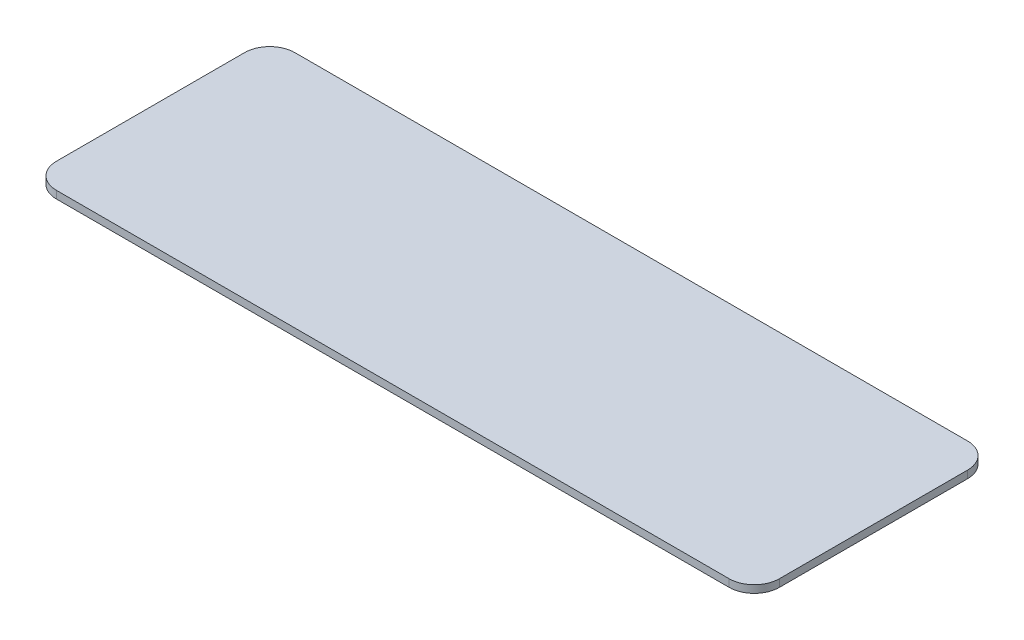
ISO-10303-21;
HEADER;
FILE_DESCRIPTION(('STEP AP214'),'2;1');
FILE_NAME('part.step','',(''),(''),'','','');
FILE_SCHEMA(('AUTOMOTIVE_DESIGN { 1 0 10303 214 1 1 1 1 }'));
ENDSEC;
DATA;
#1=APPLICATION_CONTEXT('core data for automotive mechanical design processes');
#2=APPLICATION_PROTOCOL_DEFINITION('international standard','automotive_design',2000,#1);
#3=PRODUCT_CONTEXT('',#1,'mechanical');
#4=PRODUCT('Part','Part','',(#3));
#5=PRODUCT_RELATED_PRODUCT_CATEGORY('part','',(#4));
#6=PRODUCT_DEFINITION_FORMATION('','',#4);
#7=PRODUCT_DEFINITION_CONTEXT('part definition',#1,'design');
#8=PRODUCT_DEFINITION('design','',#6,#7);
#9=PRODUCT_DEFINITION_SHAPE('','',#8);
#10=(LENGTH_UNIT() NAMED_UNIT(*) SI_UNIT(.MILLI.,.METRE.));
#11=(NAMED_UNIT(*) PLANE_ANGLE_UNIT() SI_UNIT($,.RADIAN.));
#12=(NAMED_UNIT(*) SI_UNIT($,.STERADIAN.) SOLID_ANGLE_UNIT());
#13=UNCERTAINTY_MEASURE_WITH_UNIT(LENGTH_MEASURE(1.E-05),#10,'distance_accuracy_value','');
#14=(GEOMETRIC_REPRESENTATION_CONTEXT(3) GLOBAL_UNCERTAINTY_ASSIGNED_CONTEXT((#13)) GLOBAL_UNIT_ASSIGNED_CONTEXT((#10,
#11,#12)) REPRESENTATION_CONTEXT('',''));
#15=CARTESIAN_POINT('',(0.,0.,0.));
#16=DIRECTION('',(0.,0.,1.));
#17=DIRECTION('',(1.,0.,0.));
#18=AXIS2_PLACEMENT_3D('',#15,#16,#17);
#19=CARTESIAN_POINT('',(0.,0.,0.));
#20=DIRECTION('',(0.,1.,0.));
#21=DIRECTION('',(0.,0.,1.));
#22=AXIS2_PLACEMENT_3D('',#19,#20,#21);
#23=PLANE('',#22);
#24=DIRECTION('',(-1.,0.,0.));
#25=VECTOR('',#24,1.);
#26=CARTESIAN_POINT('',(-51.4179917483649,0.,-25.8350203637618));
#27=LINE('',#26,#25);
#28=CARTESIAN_POINT('',(226.582008251635,0.,-25.8350203637618));
#29=VERTEX_POINT('',#28);
#30=CARTESIAN_POINT('',(211.582008251635,0.,-25.8350203637618));
#31=VERTEX_POINT('',#30);
#32=EDGE_CURVE('E162',#29,#31,#27,.T.);
#33=ORIENTED_EDGE('',*,*,#32,.F.);
#34=CARTESIAN_POINT('',(226.582008251635,0.,-15.8350203637618));
#35=DIRECTION('',(0.,1.,0.));
#36=DIRECTION('',(0.,0.,1.));
#37=AXIS2_PLACEMENT_3D('',#34,#35,#36);
#38=CIRCLE('',#37,10.);
#39=CARTESIAN_POINT('',(236.582008251635,0.,-15.8350203637618));
#40=VERTEX_POINT('',#39);
#41=EDGE_CURVE('E146',#29,#40,#38,.F.);
#42=ORIENTED_EDGE('',*,*,#41,.T.);
#43=DIRECTION('',(0.,0.,-1.));
#44=VECTOR('',#43,1.);
#45=CARTESIAN_POINT('',(236.582008251635,0.,-25.8350203637618));
#46=LINE('',#45,#44);
#47=CARTESIAN_POINT('',(236.582008251635,0.,59.1649796362382));
#48=VERTEX_POINT('',#47);
#49=EDGE_CURVE('E175',#48,#40,#46,.T.);
#50=ORIENTED_EDGE('',*,*,#49,.F.);
#51=CARTESIAN_POINT('',(226.582008251635,0.,59.1649796362382));
#52=DIRECTION('',(0.,1.,0.));
#53=DIRECTION('',(0.,0.,1.));
#54=AXIS2_PLACEMENT_3D('',#51,#52,#53);
#55=CIRCLE('',#54,10.);
#56=CARTESIAN_POINT('',(226.582008251635,0.,69.1649796362382));
#57=VERTEX_POINT('',#56);
#58=EDGE_CURVE('E468',#48,#57,#55,.F.);
#59=ORIENTED_EDGE('',*,*,#58,.T.);
#60=DIRECTION('',(1.,0.,0.));
#61=VECTOR('',#60,1.);
#62=CARTESIAN_POINT('',(-51.4179917483649,0.,69.1649796362382));
#63=LINE('',#62,#61);
#64=CARTESIAN_POINT('',(-41.4179917483649,0.,69.1649796362382));
#65=VERTEX_POINT('',#64);
#66=EDGE_CURVE('E185',#65,#57,#63,.T.);
#67=ORIENTED_EDGE('',*,*,#66,.F.);
#68=CARTESIAN_POINT('',(-41.4179917483649,0.,59.1649796362382));
#69=DIRECTION('',(0.,1.,0.));
#70=DIRECTION('',(0.,0.,1.));
#71=AXIS2_PLACEMENT_3D('',#68,#69,#70);
#72=CIRCLE('',#71,10.);
#73=CARTESIAN_POINT('',(-51.4179917483649,0.,59.1649796362382));
#74=VERTEX_POINT('',#73);
#75=EDGE_CURVE('E165',#65,#74,#72,.F.);
#76=ORIENTED_EDGE('',*,*,#75,.T.);
#77=DIRECTION('',(0.,0.,1.));
#78=VECTOR('',#77,1.);
#79=CARTESIAN_POINT('',(-51.4179917483649,0.,-25.8350203637618));
#80=LINE('',#79,#78);
#81=CARTESIAN_POINT('',(-51.4179917483649,0.,-15.8350203637618));
#82=VERTEX_POINT('',#81);
#83=EDGE_CURVE('E188',#82,#74,#80,.T.);
#84=ORIENTED_EDGE('',*,*,#83,.F.);
#85=CARTESIAN_POINT('',(-41.4179917483649,0.,-15.8350203637618));
#86=DIRECTION('',(0.,1.,0.));
#87=DIRECTION('',(0.,0.,1.));
#88=AXIS2_PLACEMENT_3D('',#85,#86,#87);
#89=CIRCLE('',#88,10.);
#90=CARTESIAN_POINT('',(-41.4179917483649,0.,-25.8350203637618));
#91=VERTEX_POINT('',#90);
#92=EDGE_CURVE('E156',#82,#91,#89,.F.);
#93=ORIENTED_EDGE('',*,*,#92,.T.);
#94=CARTESIAN_POINT('',(-26.417991748365,0.,-25.8350203637618));
#95=VERTEX_POINT('',#94);
#96=EDGE_CURVE('E169',#95,#91,#27,.T.);
#97=ORIENTED_EDGE('',*,*,#96,.F.);
#98=CARTESIAN_POINT('',(-26.417991748365,0.,-20.8350203637618));
#99=DIRECTION('',(0.,1.,0.));
#100=DIRECTION('',(0.,0.,1.));
#101=AXIS2_PLACEMENT_3D('',#98,#99,#100);
#102=CIRCLE('',#101,5.);
#103=CARTESIAN_POINT('',(-31.417991748365,0.,-20.8350203637618));
#104=VERTEX_POINT('',#103);
#105=EDGE_CURVE('E243',#95,#104,#102,.T.);
#106=ORIENTED_EDGE('',*,*,#105,.T.);
#107=DIRECTION('',(0.,0.,-1.));
#108=VECTOR('',#107,1.);
#109=CARTESIAN_POINT('',(-31.417991748365,0.,-25.8350203637618));
#110=LINE('',#109,#108);
#111=CARTESIAN_POINT('',(-31.417991748365,0.,44.1649796362382));
#112=VERTEX_POINT('',#111);
#113=EDGE_CURVE('E207',#112,#104,#110,.T.);
#114=ORIENTED_EDGE('',*,*,#113,.F.);
#115=CARTESIAN_POINT('',(-26.417991748365,0.,44.1649796362382));
#116=DIRECTION('',(0.,1.,0.));
#117=DIRECTION('',(0.,0.,1.));
#118=AXIS2_PLACEMENT_3D('',#115,#116,#117);
#119=CIRCLE('',#118,5.);
#120=CARTESIAN_POINT('',(-26.417991748365,0.,49.1649796362382));
#121=VERTEX_POINT('',#120);
#122=EDGE_CURVE('E241',#112,#121,#119,.T.);
#123=ORIENTED_EDGE('',*,*,#122,.T.);
#124=DIRECTION('',(-1.,0.,0.));
#125=VECTOR('',#124,1.);
#126=CARTESIAN_POINT('',(-31.417991748365,0.,49.1649796362382));
#127=LINE('',#126,#125);
#128=CARTESIAN_POINT('',(211.582008251635,0.,49.1649796362382));
#129=VERTEX_POINT('',#128);
#130=EDGE_CURVE('E198',#129,#121,#127,.T.);
#131=ORIENTED_EDGE('',*,*,#130,.F.);
#132=CARTESIAN_POINT('',(211.582008251635,0.,44.1649796362382));
#133=DIRECTION('',(0.,1.,0.));
#134=DIRECTION('',(0.,0.,1.));
#135=AXIS2_PLACEMENT_3D('',#132,#133,#134);
#136=CIRCLE('',#135,5.);
#137=CARTESIAN_POINT('',(216.582008251635,0.,44.1649796362382));
#138=VERTEX_POINT('',#137);
#139=EDGE_CURVE('E11',#129,#138,#136,.T.);
#140=ORIENTED_EDGE('',*,*,#139,.T.);
#141=DIRECTION('',(0.,0.,1.));
#142=VECTOR('',#141,1.);
#143=CARTESIAN_POINT('',(216.582008251635,0.,-25.8350203637618));
#144=LINE('',#143,#142);
#145=CARTESIAN_POINT('',(216.582008251635,0.,-20.8350203637618));
#146=VERTEX_POINT('',#145);
#147=EDGE_CURVE('E202',#146,#138,#144,.T.);
#148=ORIENTED_EDGE('',*,*,#147,.F.);
#149=CARTESIAN_POINT('',(211.582008251635,0.,-20.8350203637618));
#150=DIRECTION('',(0.,1.,0.));
#151=DIRECTION('',(0.,0.,1.));
#152=AXIS2_PLACEMENT_3D('',#149,#150,#151);
#153=CIRCLE('',#152,5.);
#154=EDGE_CURVE('E41',#146,#31,#153,.T.);
#155=ORIENTED_EDGE('',*,*,#154,.T.);
#156=EDGE_LOOP('',(#33,#42,#50,#59,#67,#76,#84,#93,#97,#106,#114,#123,#131,#140,#148,#155));
#157=FACE_BOUND('',#156,.T.);
#158=ADVANCED_FACE('F33',(#157),#23,.F.);
#159=CARTESIAN_POINT('',(-51.4179917483649,3.,-25.8350203637618));
#160=DIRECTION('',(1.,0.,0.));
#161=DIRECTION('',(0.,0.,-1.));
#162=AXIS2_PLACEMENT_3D('',#159,#160,#161);
#163=PLANE('',#162);
#164=DIRECTION('',(0.,0.,1.));
#165=VECTOR('',#164,1.);
#166=CARTESIAN_POINT('',(-51.4179917483649,3.,-25.8350203637618));
#167=LINE('',#166,#165);
#168=CARTESIAN_POINT('',(-51.4179917483649,3.,-15.8350203637618));
#169=VERTEX_POINT('',#168);
#170=CARTESIAN_POINT('',(-51.4179917483649,3.,59.1649796362382));
#171=VERTEX_POINT('',#170);
#172=EDGE_CURVE('E168',#169,#171,#167,.T.);
#173=ORIENTED_EDGE('',*,*,#172,.F.);
#174=DIRECTION('',(0.,-1.,0.));
#175=VECTOR('',#174,1.);
#176=CARTESIAN_POINT('',(-51.4179917483649,3.,-15.8350203637618));
#177=LINE('',#176,#175);
#178=EDGE_CURVE('E449',#169,#82,#177,.T.);
#179=ORIENTED_EDGE('',*,*,#178,.T.);
#180=ORIENTED_EDGE('',*,*,#83,.T.);
#181=DIRECTION('',(0.,-1.,0.));
#182=VECTOR('',#181,1.);
#183=CARTESIAN_POINT('',(-51.4179917483649,3.,59.1649796362382));
#184=LINE('',#183,#182);
#185=EDGE_CURVE('E446',#74,#171,#184,.F.);
#186=ORIENTED_EDGE('',*,*,#185,.T.);
#187=EDGE_LOOP('',(#173,#179,#180,#186));
#188=FACE_BOUND('',#187,.T.);
#189=ADVANCED_FACE('F288',(#188),#163,.F.);
#190=CARTESIAN_POINT('',(-51.4179917483649,3.,69.1649796362382));
#191=DIRECTION('',(0.,0.,-1.));
#192=DIRECTION('',(-1.,0.,0.));
#193=AXIS2_PLACEMENT_3D('',#190,#191,#192);
#194=PLANE('',#193);
#195=ORIENTED_EDGE('',*,*,#66,.T.);
#196=DIRECTION('',(0.,-1.,0.));
#197=VECTOR('',#196,1.);
#198=CARTESIAN_POINT('',(226.582008251635,3.,69.1649796362382));
#199=LINE('',#198,#197);
#200=CARTESIAN_POINT('',(226.582008251635,3.,69.1649796362382));
#201=VERTEX_POINT('',#200);
#202=EDGE_CURVE('E211',#57,#201,#199,.F.);
#203=ORIENTED_EDGE('',*,*,#202,.T.);
#204=DIRECTION('',(1.,0.,0.));
#205=VECTOR('',#204,1.);
#206=CARTESIAN_POINT('',(-51.4179917483649,3.,69.1649796362382));
#207=LINE('',#206,#205);
#208=CARTESIAN_POINT('',(-41.4179917483649,3.,69.1649796362382));
#209=VERTEX_POINT('',#208);
#210=EDGE_CURVE('E172',#209,#201,#207,.T.);
#211=ORIENTED_EDGE('',*,*,#210,.F.);
#212=DIRECTION('',(0.,-1.,0.));
#213=VECTOR('',#212,1.);
#214=CARTESIAN_POINT('',(-41.4179917483649,3.,69.1649796362382));
#215=LINE('',#214,#213);
#216=EDGE_CURVE('E455',#209,#65,#215,.T.);
#217=ORIENTED_EDGE('',*,*,#216,.T.);
#218=EDGE_LOOP('',(#195,#203,#211,#217));
#219=FACE_BOUND('',#218,.T.);
#220=ADVANCED_FACE('F293',(#219),#194,.F.);
#221=CARTESIAN_POINT('',(236.582008251635,3.,-25.8350203637618));
#222=DIRECTION('',(-1.,0.,0.));
#223=DIRECTION('',(0.,0.,1.));
#224=AXIS2_PLACEMENT_3D('',#221,#222,#223);
#225=PLANE('',#224);
#226=ORIENTED_EDGE('',*,*,#49,.T.);
#227=DIRECTION('',(0.,-1.,0.));
#228=VECTOR('',#227,1.);
#229=CARTESIAN_POINT('',(236.582008251635,3.,-15.8350203637618));
#230=LINE('',#229,#228);
#231=CARTESIAN_POINT('',(236.582008251635,3.,-15.8350203637618));
#232=VERTEX_POINT('',#231);
#233=EDGE_CURVE('E151',#40,#232,#230,.F.);
#234=ORIENTED_EDGE('',*,*,#233,.T.);
#235=DIRECTION('',(0.,0.,-1.));
#236=VECTOR('',#235,1.);
#237=CARTESIAN_POINT('',(236.582008251635,3.,-25.8350203637618));
#238=LINE('',#237,#236);
#239=CARTESIAN_POINT('',(236.582008251635,3.,59.1649796362382));
#240=VERTEX_POINT('',#239);
#241=EDGE_CURVE('E193',#240,#232,#238,.T.);
#242=ORIENTED_EDGE('',*,*,#241,.F.);
#243=DIRECTION('',(0.,-1.,0.));
#244=VECTOR('',#243,1.);
#245=CARTESIAN_POINT('',(236.582008251635,3.,59.1649796362382));
#246=LINE('',#245,#244);
#247=EDGE_CURVE('E155',#240,#48,#246,.T.);
#248=ORIENTED_EDGE('',*,*,#247,.T.);
#249=EDGE_LOOP('',(#226,#234,#242,#248));
#250=FACE_BOUND('',#249,.T.);
#251=ADVANCED_FACE('F302',(#250),#225,.F.);
#252=CARTESIAN_POINT('',(-51.4179917483649,3.,-25.8350203637618));
#253=DIRECTION('',(0.,0.,1.));
#254=DIRECTION('',(1.,0.,0.));
#255=AXIS2_PLACEMENT_3D('',#252,#253,#254);
#256=PLANE('',#255);
#257=DIRECTION('',(1.,0.,0.));
#258=VECTOR('',#257,1.);
#259=CARTESIAN_POINT('',(-31.417991748365,-6.,-25.8350203637618));
#260=LINE('',#259,#258);
#261=CARTESIAN_POINT('',(-26.417991748365,-6.,-25.8350203637618));
#262=VERTEX_POINT('',#261);
#263=CARTESIAN_POINT('',(211.582008251635,-6.,-25.8350203637618));
#264=VERTEX_POINT('',#263);
#265=EDGE_CURVE('E260',#262,#264,#260,.T.);
#266=ORIENTED_EDGE('',*,*,#265,.F.);
#267=DIRECTION('',(0.,1.,0.));
#268=VECTOR('',#267,1.);
#269=CARTESIAN_POINT('',(-26.417991748365,3.,-25.8350203637618));
#270=LINE('',#269,#268);
#271=EDGE_CURVE('E233',#262,#95,#270,.T.);
#272=ORIENTED_EDGE('',*,*,#271,.T.);
#273=ORIENTED_EDGE('',*,*,#96,.T.);
#274=DIRECTION('',(0.,-1.,0.));
#275=VECTOR('',#274,1.);
#276=CARTESIAN_POINT('',(-41.4179917483649,3.,-25.8350203637618));
#277=LINE('',#276,#275);
#278=CARTESIAN_POINT('',(-41.4179917483649,3.,-25.8350203637618));
#279=VERTEX_POINT('',#278);
#280=EDGE_CURVE('E166',#91,#279,#277,.F.);
#281=ORIENTED_EDGE('',*,*,#280,.T.);
#282=DIRECTION('',(-1.,0.,0.));
#283=VECTOR('',#282,1.);
#284=CARTESIAN_POINT('',(-51.4179917483649,3.,-25.8350203637618));
#285=LINE('',#284,#283);
#286=CARTESIAN_POINT('',(226.582008251635,3.,-25.8350203637618));
#287=VERTEX_POINT('',#286);
#288=EDGE_CURVE('E164',#287,#279,#285,.T.);
#289=ORIENTED_EDGE('',*,*,#288,.F.);
#290=DIRECTION('',(0.,-1.,0.));
#291=VECTOR('',#290,1.);
#292=CARTESIAN_POINT('',(226.582008251635,3.,-25.8350203637618));
#293=LINE('',#292,#291);
#294=EDGE_CURVE('E150',#287,#29,#293,.T.);
#295=ORIENTED_EDGE('',*,*,#294,.T.);
#296=ORIENTED_EDGE('',*,*,#32,.T.);
#297=DIRECTION('',(0.,1.,0.));
#298=VECTOR('',#297,1.);
#299=CARTESIAN_POINT('',(211.582008251635,3.,-25.8350203637618));
#300=LINE('',#299,#298);
#301=EDGE_CURVE('E231',#31,#264,#300,.F.);
#302=ORIENTED_EDGE('',*,*,#301,.T.);
#303=EDGE_LOOP('',(#266,#272,#273,#281,#289,#295,#296,#302));
#304=FACE_BOUND('',#303,.T.);
#305=ADVANCED_FACE('F161',(#304),#256,.F.);
#306=CARTESIAN_POINT('',(0.,3.,0.));
#307=DIRECTION('',(0.,1.,0.));
#308=DIRECTION('',(0.,0.,1.));
#309=AXIS2_PLACEMENT_3D('',#306,#307,#308);
#310=PLANE('',#309);
#311=ORIENTED_EDGE('',*,*,#241,.T.);
#312=CARTESIAN_POINT('',(226.582008251635,3.,-15.8350203637618));
#313=DIRECTION('',(0.,1.,0.));
#314=DIRECTION('',(0.,0.,1.));
#315=AXIS2_PLACEMENT_3D('',#312,#313,#314);
#316=CIRCLE('',#315,10.);
#317=EDGE_CURVE('E441',#232,#287,#316,.T.);
#318=ORIENTED_EDGE('',*,*,#317,.T.);
#319=ORIENTED_EDGE('',*,*,#288,.T.);
#320=CARTESIAN_POINT('',(-41.4179917483649,3.,-15.8350203637618));
#321=DIRECTION('',(0.,1.,0.));
#322=DIRECTION('',(0.,0.,1.));
#323=AXIS2_PLACEMENT_3D('',#320,#321,#322);
#324=CIRCLE('',#323,10.);
#325=EDGE_CURVE('E447',#279,#169,#324,.T.);
#326=ORIENTED_EDGE('',*,*,#325,.T.);
#327=ORIENTED_EDGE('',*,*,#172,.T.);
#328=CARTESIAN_POINT('',(-41.4179917483649,3.,59.1649796362382));
#329=DIRECTION('',(0.,1.,0.));
#330=DIRECTION('',(0.,0.,1.));
#331=AXIS2_PLACEMENT_3D('',#328,#329,#330);
#332=CIRCLE('',#331,10.);
#333=EDGE_CURVE('E462',#171,#209,#332,.T.);
#334=ORIENTED_EDGE('',*,*,#333,.T.);
#335=ORIENTED_EDGE('',*,*,#210,.T.);
#336=CARTESIAN_POINT('',(226.582008251635,3.,59.1649796362382));
#337=DIRECTION('',(0.,1.,0.));
#338=DIRECTION('',(0.,0.,1.));
#339=AXIS2_PLACEMENT_3D('',#336,#337,#338);
#340=CIRCLE('',#339,10.);
#341=EDGE_CURVE('E443',#201,#240,#340,.T.);
#342=ORIENTED_EDGE('',*,*,#341,.T.);
#343=EDGE_LOOP('',(#311,#318,#319,#326,#327,#334,#335,#342));
#344=FACE_BOUND('',#343,.T.);
#345=ADVANCED_FACE('F298',(#344),#310,.T.);
#346=CARTESIAN_POINT('',(-31.417991748365,-6.,-25.8350203637618));
#347=DIRECTION('',(1.,0.,0.));
#348=DIRECTION('',(0.,0.,-1.));
#349=AXIS2_PLACEMENT_3D('',#346,#347,#348);
#350=PLANE('',#349);
#351=DIRECTION('',(0.,0.,-1.));
#352=VECTOR('',#351,1.);
#353=CARTESIAN_POINT('',(-31.417991748365,-6.,-25.8350203637618));
#354=LINE('',#353,#352);
#355=CARTESIAN_POINT('',(-31.417991748365,-6.,44.1649796362382));
#356=VERTEX_POINT('',#355);
#357=CARTESIAN_POINT('',(-31.417991748365,-6.,-20.8350203637618));
#358=VERTEX_POINT('',#357);
#359=EDGE_CURVE('E201',#356,#358,#354,.T.);
#360=ORIENTED_EDGE('',*,*,#359,.F.);
#361=DIRECTION('',(0.,1.,0.));
#362=VECTOR('',#361,1.);
#363=CARTESIAN_POINT('',(-31.417991748365,-6.,44.1649796362382));
#364=LINE('',#363,#362);
#365=EDGE_CURVE('E215',#356,#112,#364,.T.);
#366=ORIENTED_EDGE('',*,*,#365,.T.);
#367=ORIENTED_EDGE('',*,*,#113,.T.);
#368=DIRECTION('',(0.,1.,0.));
#369=VECTOR('',#368,1.);
#370=CARTESIAN_POINT('',(-31.417991748365,-6.,-20.8350203637618));
#371=LINE('',#370,#369);
#372=EDGE_CURVE('E213',#104,#358,#371,.F.);
#373=ORIENTED_EDGE('',*,*,#372,.T.);
#374=EDGE_LOOP('',(#360,#366,#367,#373));
#375=FACE_BOUND('',#374,.T.);
#376=ADVANCED_FACE('F251',(#375),#350,.F.);
#377=CARTESIAN_POINT('',(216.582008251635,-6.,-25.8350203637618));
#378=DIRECTION('',(-1.,0.,0.));
#379=DIRECTION('',(0.,0.,1.));
#380=AXIS2_PLACEMENT_3D('',#377,#378,#379);
#381=PLANE('',#380);
#382=DIRECTION('',(0.,0.,1.));
#383=VECTOR('',#382,1.);
#384=CARTESIAN_POINT('',(216.582008251635,-6.,-25.8350203637618));
#385=LINE('',#384,#383);
#386=CARTESIAN_POINT('',(216.582008251635,-6.,-20.8350203637618));
#387=VERTEX_POINT('',#386);
#388=CARTESIAN_POINT('',(216.582008251635,-6.,44.1649796362382));
#389=VERTEX_POINT('',#388);
#390=EDGE_CURVE('E262',#387,#389,#385,.T.);
#391=ORIENTED_EDGE('',*,*,#390,.F.);
#392=DIRECTION('',(0.,1.,0.));
#393=VECTOR('',#392,1.);
#394=CARTESIAN_POINT('',(216.582008251635,-6.,-20.8350203637618));
#395=LINE('',#394,#393);
#396=EDGE_CURVE('E239',#387,#146,#395,.T.);
#397=ORIENTED_EDGE('',*,*,#396,.T.);
#398=ORIENTED_EDGE('',*,*,#147,.T.);
#399=DIRECTION('',(0.,1.,0.));
#400=VECTOR('',#399,1.);
#401=CARTESIAN_POINT('',(216.582008251635,-6.,44.1649796362382));
#402=LINE('',#401,#400);
#403=EDGE_CURVE('E236',#138,#389,#402,.F.);
#404=ORIENTED_EDGE('',*,*,#403,.T.);
#405=EDGE_LOOP('',(#391,#397,#398,#404));
#406=FACE_BOUND('',#405,.T.);
#407=ADVANCED_FACE('F279',(#406),#381,.F.);
#408=CARTESIAN_POINT('',(-31.417991748365,-6.,49.1649796362382));
#409=DIRECTION('',(0.,0.,-1.));
#410=DIRECTION('',(-1.,0.,0.));
#411=AXIS2_PLACEMENT_3D('',#408,#409,#410);
#412=PLANE('',#411);
#413=ORIENTED_EDGE('',*,*,#130,.T.);
#414=DIRECTION('',(0.,1.,0.));
#415=VECTOR('',#414,1.);
#416=CARTESIAN_POINT('',(-26.417991748365,-6.,49.1649796362382));
#417=LINE('',#416,#415);
#418=CARTESIAN_POINT('',(-26.417991748365,-6.,49.1649796362382));
#419=VERTEX_POINT('',#418);
#420=EDGE_CURVE('E221',#121,#419,#417,.F.);
#421=ORIENTED_EDGE('',*,*,#420,.T.);
#422=DIRECTION('',(-1.,0.,0.));
#423=VECTOR('',#422,1.);
#424=CARTESIAN_POINT('',(-31.417991748365,-6.,49.1649796362382));
#425=LINE('',#424,#423);
#426=CARTESIAN_POINT('',(211.582008251635,-6.,49.1649796362382));
#427=VERTEX_POINT('',#426);
#428=EDGE_CURVE('E191',#427,#419,#425,.T.);
#429=ORIENTED_EDGE('',*,*,#428,.F.);
#430=DIRECTION('',(0.,1.,0.));
#431=VECTOR('',#430,1.);
#432=CARTESIAN_POINT('',(211.582008251635,-6.,49.1649796362382));
#433=LINE('',#432,#431);
#434=EDGE_CURVE('E218',#427,#129,#433,.T.);
#435=ORIENTED_EDGE('',*,*,#434,.T.);
#436=EDGE_LOOP('',(#413,#421,#429,#435));
#437=FACE_BOUND('',#436,.T.);
#438=ADVANCED_FACE('F275',(#437),#412,.F.);
#439=CARTESIAN_POINT('',(0.,-6.,0.));
#440=DIRECTION('',(0.,1.,0.));
#441=DIRECTION('',(0.,0.,1.));
#442=AXIS2_PLACEMENT_3D('',#439,#440,#441);
#443=PLANE('',#442);
#444=ORIENTED_EDGE('',*,*,#428,.T.);
#445=CARTESIAN_POINT('',(-26.417991748365,-6.,44.1649796362382));
#446=DIRECTION('',(0.,1.,0.));
#447=DIRECTION('',(0.,0.,1.));
#448=AXIS2_PLACEMENT_3D('',#445,#446,#447);
#449=CIRCLE('',#448,5.);
#450=EDGE_CURVE('E229',#419,#356,#449,.F.);
#451=ORIENTED_EDGE('',*,*,#450,.T.);
#452=ORIENTED_EDGE('',*,*,#359,.T.);
#453=CARTESIAN_POINT('',(-26.417991748365,-6.,-20.8350203637618));
#454=DIRECTION('',(0.,1.,0.));
#455=DIRECTION('',(0.,0.,1.));
#456=AXIS2_PLACEMENT_3D('',#453,#454,#455);
#457=CIRCLE('',#456,5.);
#458=EDGE_CURVE('E227',#358,#262,#457,.F.);
#459=ORIENTED_EDGE('',*,*,#458,.T.);
#460=ORIENTED_EDGE('',*,*,#265,.T.);
#461=CARTESIAN_POINT('',(211.582008251635,-6.,-20.8350203637618));
#462=DIRECTION('',(0.,1.,0.));
#463=DIRECTION('',(0.,0.,1.));
#464=AXIS2_PLACEMENT_3D('',#461,#462,#463);
#465=CIRCLE('',#464,5.);
#466=EDGE_CURVE('E225',#264,#387,#465,.F.);
#467=ORIENTED_EDGE('',*,*,#466,.T.);
#468=ORIENTED_EDGE('',*,*,#390,.T.);
#469=CARTESIAN_POINT('',(211.582008251635,-6.,44.1649796362382));
#470=DIRECTION('',(0.,1.,0.));
#471=DIRECTION('',(0.,0.,1.));
#472=AXIS2_PLACEMENT_3D('',#469,#470,#471);
#473=CIRCLE('',#472,5.);
#474=EDGE_CURVE('E223',#389,#427,#473,.F.);
#475=ORIENTED_EDGE('',*,*,#474,.T.);
#476=EDGE_LOOP('',(#444,#451,#452,#459,#460,#467,#468,#475));
#477=FACE_BOUND('',#476,.T.);
#478=ADVANCED_FACE('F259',(#477),#443,.F.);
#479=CARTESIAN_POINT('',(226.582008251635,3.,-15.8350203637618));
#480=DIRECTION('',(0.,-1.,0.));
#481=DIRECTION('',(0.,0.,-1.));
#482=AXIS2_PLACEMENT_3D('',#479,#480,#481);
#483=CYLINDRICAL_SURFACE('',#482,10.);
#484=ORIENTED_EDGE('',*,*,#317,.F.);
#485=ORIENTED_EDGE('',*,*,#233,.F.);
#486=ORIENTED_EDGE('',*,*,#41,.F.);
#487=ORIENTED_EDGE('',*,*,#294,.F.);
#488=EDGE_LOOP('',(#484,#485,#486,#487));
#489=FACE_BOUND('',#488,.T.);
#490=ADVANCED_FACE('F149',(#489),#483,.T.);
#491=CARTESIAN_POINT('',(-41.4179917483649,3.,-15.8350203637618));
#492=DIRECTION('',(0.,-1.,0.));
#493=DIRECTION('',(0.,0.,-1.));
#494=AXIS2_PLACEMENT_3D('',#491,#492,#493);
#495=CYLINDRICAL_SURFACE('',#494,10.);
#496=ORIENTED_EDGE('',*,*,#325,.F.);
#497=ORIENTED_EDGE('',*,*,#280,.F.);
#498=ORIENTED_EDGE('',*,*,#92,.F.);
#499=ORIENTED_EDGE('',*,*,#178,.F.);
#500=EDGE_LOOP('',(#496,#497,#498,#499));
#501=FACE_BOUND('',#500,.T.);
#502=ADVANCED_FACE('F311',(#501),#495,.T.);
#503=CARTESIAN_POINT('',(226.582008251635,3.,59.1649796362382));
#504=DIRECTION('',(0.,-1.,0.));
#505=DIRECTION('',(0.,0.,-1.));
#506=AXIS2_PLACEMENT_3D('',#503,#504,#505);
#507=CYLINDRICAL_SURFACE('',#506,10.);
#508=ORIENTED_EDGE('',*,*,#341,.F.);
#509=ORIENTED_EDGE('',*,*,#202,.F.);
#510=ORIENTED_EDGE('',*,*,#58,.F.);
#511=ORIENTED_EDGE('',*,*,#247,.F.);
#512=EDGE_LOOP('',(#508,#509,#510,#511));
#513=FACE_BOUND('',#512,.T.);
#514=ADVANCED_FACE('F314',(#513),#507,.T.);
#515=CARTESIAN_POINT('',(-41.4179917483649,3.,59.1649796362382));
#516=DIRECTION('',(0.,-1.,0.));
#517=DIRECTION('',(0.,0.,-1.));
#518=AXIS2_PLACEMENT_3D('',#515,#516,#517);
#519=CYLINDRICAL_SURFACE('',#518,10.);
#520=ORIENTED_EDGE('',*,*,#333,.F.);
#521=ORIENTED_EDGE('',*,*,#185,.F.);
#522=ORIENTED_EDGE('',*,*,#75,.F.);
#523=ORIENTED_EDGE('',*,*,#216,.F.);
#524=EDGE_LOOP('',(#520,#521,#522,#523));
#525=FACE_BOUND('',#524,.T.);
#526=ADVANCED_FACE('F318',(#525),#519,.T.);
#527=CARTESIAN_POINT('',(-26.417991748365,-6.,44.1649796362382));
#528=DIRECTION('',(0.,1.,0.));
#529=DIRECTION('',(0.,0.,1.));
#530=AXIS2_PLACEMENT_3D('',#527,#528,#529);
#531=CYLINDRICAL_SURFACE('',#530,5.);
#532=ORIENTED_EDGE('',*,*,#450,.F.);
#533=ORIENTED_EDGE('',*,*,#420,.F.);
#534=ORIENTED_EDGE('',*,*,#122,.F.);
#535=ORIENTED_EDGE('',*,*,#365,.F.);
#536=EDGE_LOOP('',(#532,#533,#534,#535));
#537=FACE_BOUND('',#536,.T.);
#538=ADVANCED_FACE('F274',(#537),#531,.T.);
#539=CARTESIAN_POINT('',(-26.417991748365,3.,-20.8350203637618));
#540=DIRECTION('',(0.,1.,0.));
#541=DIRECTION('',(0.,0.,1.));
#542=AXIS2_PLACEMENT_3D('',#539,#540,#541);
#543=CYLINDRICAL_SURFACE('',#542,5.);
#544=ORIENTED_EDGE('',*,*,#458,.F.);
#545=ORIENTED_EDGE('',*,*,#372,.F.);
#546=ORIENTED_EDGE('',*,*,#105,.F.);
#547=ORIENTED_EDGE('',*,*,#271,.F.);
#548=EDGE_LOOP('',(#544,#545,#546,#547));
#549=FACE_BOUND('',#548,.T.);
#550=ADVANCED_FACE('F255',(#549),#543,.T.);
#551=CARTESIAN_POINT('',(211.582008251635,-6.,-20.8350203637618));
#552=DIRECTION('',(0.,1.,0.));
#553=DIRECTION('',(0.,0.,1.));
#554=AXIS2_PLACEMENT_3D('',#551,#552,#553);
#555=CYLINDRICAL_SURFACE('',#554,5.);
#556=ORIENTED_EDGE('',*,*,#466,.F.);
#557=ORIENTED_EDGE('',*,*,#301,.F.);
#558=ORIENTED_EDGE('',*,*,#154,.F.);
#559=ORIENTED_EDGE('',*,*,#396,.F.);
#560=EDGE_LOOP('',(#556,#557,#558,#559));
#561=FACE_BOUND('',#560,.T.);
#562=ADVANCED_FACE('F280',(#561),#555,.T.);
#563=CARTESIAN_POINT('',(211.582008251635,-6.,44.1649796362382));
#564=DIRECTION('',(0.,1.,0.));
#565=DIRECTION('',(0.,0.,1.));
#566=AXIS2_PLACEMENT_3D('',#563,#564,#565);
#567=CYLINDRICAL_SURFACE('',#566,5.);
#568=ORIENTED_EDGE('',*,*,#474,.F.);
#569=ORIENTED_EDGE('',*,*,#403,.F.);
#570=ORIENTED_EDGE('',*,*,#139,.F.);
#571=ORIENTED_EDGE('',*,*,#434,.F.);
#572=EDGE_LOOP('',(#568,#569,#570,#571));
#573=FACE_BOUND('',#572,.T.);
#574=ADVANCED_FACE('F35',(#573),#567,.T.);
#575=CLOSED_SHELL('',(#158,#189,#220,#251,#305,#345,#376,#407,#438,#478,#490,#502,#514,#526,
#538,#550,#562,#574));
#576=MANIFOLD_SOLID_BREP('B2',#575);
#577=ADVANCED_BREP_SHAPE_REPRESENTATION('',(#18,#576),#14);
#578=SHAPE_DEFINITION_REPRESENTATION(#9,#577);
ENDSEC;
END-ISO-10303-21;
